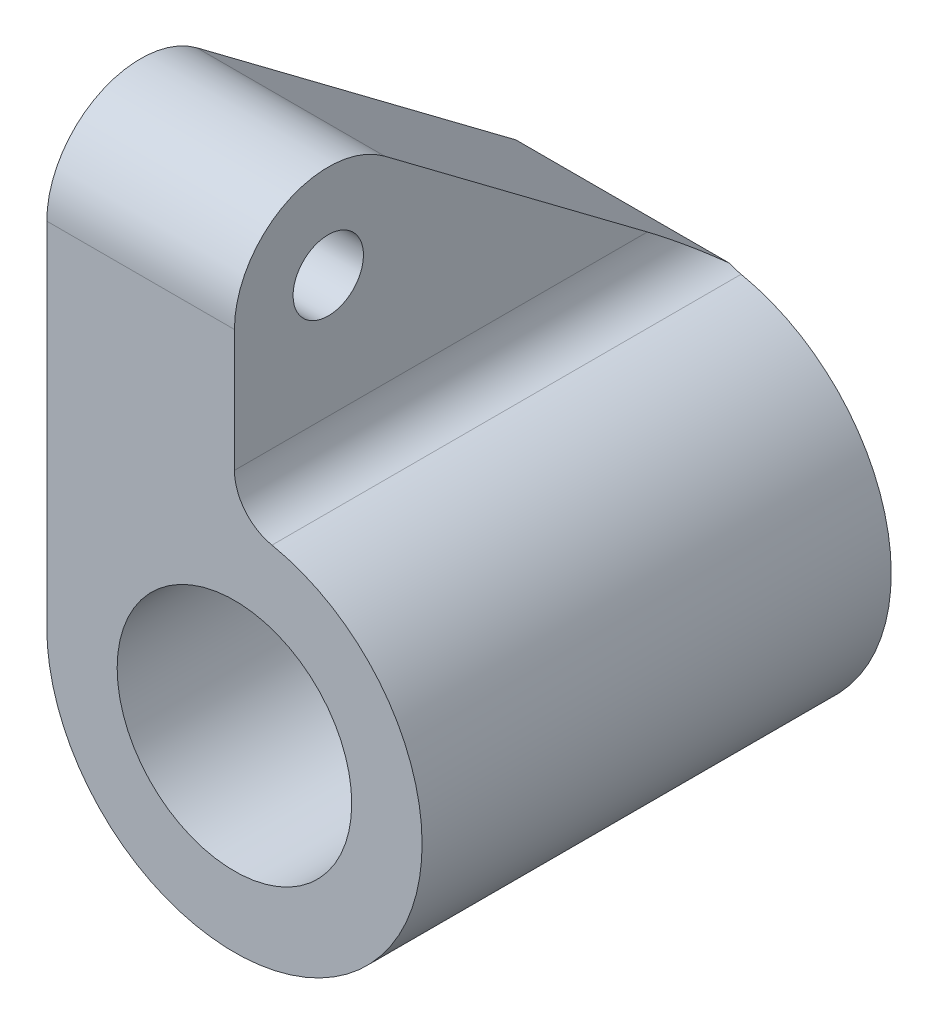
ISO-10303-21;
HEADER;
FILE_DESCRIPTION(('STEP AP214'),'2;1');
FILE_NAME('part.step','',(''),(''),'','','');
FILE_SCHEMA(('AUTOMOTIVE_DESIGN { 1 0 10303 214 1 1 1 1 }'));
ENDSEC;
DATA;
#1=APPLICATION_CONTEXT('core data for automotive mechanical design processes');
#2=APPLICATION_PROTOCOL_DEFINITION('international standard','automotive_design',2000,#1);
#3=PRODUCT_CONTEXT('',#1,'mechanical');
#4=PRODUCT('Part','Part','',(#3));
#5=PRODUCT_RELATED_PRODUCT_CATEGORY('part','',(#4));
#6=PRODUCT_DEFINITION_FORMATION('','',#4);
#7=PRODUCT_DEFINITION_CONTEXT('part definition',#1,'design');
#8=PRODUCT_DEFINITION('design','',#6,#7);
#9=PRODUCT_DEFINITION_SHAPE('','',#8);
#10=(LENGTH_UNIT() NAMED_UNIT(*) SI_UNIT(.MILLI.,.METRE.));
#11=(NAMED_UNIT(*) PLANE_ANGLE_UNIT() SI_UNIT($,.RADIAN.));
#12=(NAMED_UNIT(*) SI_UNIT($,.STERADIAN.) SOLID_ANGLE_UNIT());
#13=UNCERTAINTY_MEASURE_WITH_UNIT(LENGTH_MEASURE(1.E-05),#10,'distance_accuracy_value','');
#14=(GEOMETRIC_REPRESENTATION_CONTEXT(3) GLOBAL_UNCERTAINTY_ASSIGNED_CONTEXT((#13)) GLOBAL_UNIT_ASSIGNED_CONTEXT((#10,
#11,#12)) REPRESENTATION_CONTEXT('',''));
#15=CARTESIAN_POINT('',(0.,0.,0.));
#16=DIRECTION('',(0.,0.,1.));
#17=DIRECTION('',(1.,0.,0.));
#18=AXIS2_PLACEMENT_3D('',#15,#16,#17);
#19=CARTESIAN_POINT('',(0.,0.,20.));
#20=DIRECTION('',(0.,0.,1.));
#21=DIRECTION('',(1.,0.,0.));
#22=AXIS2_PLACEMENT_3D('',#19,#20,#21);
#23=PLANE('',#22);
#24=DIRECTION('',(-1.,0.,0.));
#25=VECTOR('',#24,1.);
#26=CARTESIAN_POINT('',(8.,15.,20.));
#27=LINE('',#26,#25);
#28=CARTESIAN_POINT('',(0.,15.,20.));
#29=VERTEX_POINT('',#28);
#30=CARTESIAN_POINT('',(-8.,15.,20.));
#31=VERTEX_POINT('',#30);
#32=EDGE_CURVE('E159',#29,#31,#27,.T.);
#33=ORIENTED_EDGE('',*,*,#32,.T.);
#34=DIRECTION('',(0.,-1.,0.));
#35=VECTOR('',#34,1.);
#36=CARTESIAN_POINT('',(-8.,0.,20.));
#37=LINE('',#36,#35);
#38=CARTESIAN_POINT('',(-8.,0.,20.));
#39=VERTEX_POINT('',#38);
#40=EDGE_CURVE('E115',#31,#39,#37,.T.);
#41=ORIENTED_EDGE('',*,*,#40,.T.);
#42=CARTESIAN_POINT('',(0.,0.,20.));
#43=DIRECTION('',(0.,0.,1.));
#44=DIRECTION('',(1.,0.,0.));
#45=AXIS2_PLACEMENT_3D('',#42,#43,#44);
#46=CIRCLE('',#45,8.);
#47=CARTESIAN_POINT('',(1.6,7.83836717690617,20.));
#48=VERTEX_POINT('',#47);
#49=EDGE_CURVE('E131',#39,#48,#46,.T.);
#50=ORIENTED_EDGE('',*,*,#49,.T.);
#51=CARTESIAN_POINT('',(2.,9.79795897113271,20.));
#52=DIRECTION('',(0.,0.,1.));
#53=DIRECTION('',(1.,0.,0.));
#54=AXIS2_PLACEMENT_3D('',#51,#52,#53);
#55=CIRCLE('',#54,2.);
#56=CARTESIAN_POINT('',(0.,9.79795897113271,20.));
#57=VERTEX_POINT('',#56);
#58=EDGE_CURVE('E146',#48,#57,#55,.F.);
#59=ORIENTED_EDGE('',*,*,#58,.T.);
#60=DIRECTION('',(0.,1.,0.));
#61=VECTOR('',#60,1.);
#62=CARTESIAN_POINT('',(0.,20.,20.));
#63=LINE('',#62,#61);
#64=EDGE_CURVE('E119',#57,#29,#63,.T.);
#65=ORIENTED_EDGE('',*,*,#64,.T.);
#66=EDGE_LOOP('',(#33,#41,#50,#59,#65));
#67=FACE_BOUND('',#66,.T.);
#68=CARTESIAN_POINT('',(0.,0.,20.));
#69=DIRECTION('',(0.,0.,1.));
#70=DIRECTION('',(1.,0.,0.));
#71=AXIS2_PLACEMENT_3D('',#68,#69,#70);
#72=CIRCLE('',#71,5.);
#73=CARTESIAN_POINT('',(5.,0.,20.));
#74=VERTEX_POINT('',#73);
#75=EDGE_CURVE('E126',#74,#74,#72,.T.);
#76=ORIENTED_EDGE('',*,*,#75,.F.);
#77=EDGE_LOOP('',(#76));
#78=FACE_BOUND('',#77,.T.);
#79=ADVANCED_FACE('F39',(#67,#78),#23,.T.);
#80=CARTESIAN_POINT('',(0.,0.,0.));
#81=DIRECTION('',(0.,0.,1.));
#82=DIRECTION('',(1.,0.,0.));
#83=AXIS2_PLACEMENT_3D('',#80,#81,#82);
#84=PLANE('',#83);
#85=DIRECTION('',(0.,-1.,0.));
#86=VECTOR('',#85,1.);
#87=CARTESIAN_POINT('',(-8.,0.,0.));
#88=LINE('',#87,#86);
#89=CARTESIAN_POINT('',(-8.,8.,0.));
#90=VERTEX_POINT('',#89);
#91=CARTESIAN_POINT('',(-8.,0.,0.));
#92=VERTEX_POINT('',#91);
#93=EDGE_CURVE('E105',#90,#92,#88,.T.);
#94=ORIENTED_EDGE('',*,*,#93,.F.);
#95=DIRECTION('',(-1.,0.,0.));
#96=VECTOR('',#95,1.);
#97=CARTESIAN_POINT('',(8.,8.,0.));
#98=LINE('',#97,#96);
#99=CARTESIAN_POINT('',(1.12401852866433,8.,0.));
#100=VERTEX_POINT('',#99);
#101=EDGE_CURVE('E53',#100,#90,#98,.T.);
#102=ORIENTED_EDGE('',*,*,#101,.F.);
#103=CARTESIAN_POINT('',(2.,9.79795897113271,0.));
#104=DIRECTION('',(0.,0.,1.));
#105=DIRECTION('',(1.,0.,0.));
#106=AXIS2_PLACEMENT_3D('',#103,#104,#105);
#107=CIRCLE('',#106,2.);
#108=CARTESIAN_POINT('',(1.6,7.83836717690617,0.));
#109=VERTEX_POINT('',#108);
#110=EDGE_CURVE('E11',#100,#109,#107,.T.);
#111=ORIENTED_EDGE('',*,*,#110,.T.);
#112=CARTESIAN_POINT('',(0.,0.,0.));
#113=DIRECTION('',(0.,0.,1.));
#114=DIRECTION('',(1.,0.,0.));
#115=AXIS2_PLACEMENT_3D('',#112,#113,#114);
#116=CIRCLE('',#115,8.);
#117=EDGE_CURVE('E113',#92,#109,#116,.T.);
#118=ORIENTED_EDGE('',*,*,#117,.F.);
#119=EDGE_LOOP('',(#94,#102,#111,#118));
#120=FACE_BOUND('',#119,.T.);
#121=CARTESIAN_POINT('',(0.,0.,0.));
#122=DIRECTION('',(0.,0.,1.));
#123=DIRECTION('',(1.,0.,0.));
#124=AXIS2_PLACEMENT_3D('',#121,#122,#123);
#125=CIRCLE('',#124,5.);
#126=CARTESIAN_POINT('',(5.,0.,0.));
#127=VERTEX_POINT('',#126);
#128=EDGE_CURVE('E117',#127,#127,#125,.T.);
#129=ORIENTED_EDGE('',*,*,#128,.T.);
#130=EDGE_LOOP('',(#129));
#131=FACE_BOUND('',#130,.T.);
#132=ADVANCED_FACE('F110',(#120,#131),#84,.F.);
#133=CARTESIAN_POINT('',(0.,0.,20.));
#134=DIRECTION('',(0.,0.,-1.));
#135=DIRECTION('',(-1.,0.,0.));
#136=AXIS2_PLACEMENT_3D('',#133,#134,#135);
#137=CYLINDRICAL_SURFACE('',#136,8.);
#138=ORIENTED_EDGE('',*,*,#117,.T.);
#139=DIRECTION('',(0.,0.,-1.));
#140=VECTOR('',#139,1.);
#141=CARTESIAN_POINT('',(1.6,7.83836717690617,20.));
#142=LINE('',#141,#140);
#143=EDGE_CURVE('E142',#109,#48,#142,.F.);
#144=ORIENTED_EDGE('',*,*,#143,.T.);
#145=ORIENTED_EDGE('',*,*,#49,.F.);
#146=DIRECTION('',(0.,0.,1.));
#147=VECTOR('',#146,1.);
#148=CARTESIAN_POINT('',(-8.,0.,0.));
#149=LINE('',#148,#147);
#150=EDGE_CURVE('E114',#92,#39,#149,.T.);
#151=ORIENTED_EDGE('',*,*,#150,.F.);
#152=EDGE_LOOP('',(#138,#144,#145,#151));
#153=FACE_BOUND('',#152,.T.);
#154=ADVANCED_FACE('F158',(#153),#137,.T.);
#155=CARTESIAN_POINT('',(0.,0.,20.));
#156=DIRECTION('',(0.,0.,-1.));
#157=DIRECTION('',(-1.,0.,0.));
#158=AXIS2_PLACEMENT_3D('',#155,#156,#157);
#159=CYLINDRICAL_SURFACE('',#158,5.);
#160=ORIENTED_EDGE('',*,*,#75,.T.);
#161=EDGE_LOOP('',(#160));
#162=FACE_BOUND('',#161,.T.);
#163=ORIENTED_EDGE('',*,*,#128,.F.);
#164=EDGE_LOOP('',(#163));
#165=FACE_BOUND('',#164,.T.);
#166=ADVANCED_FACE('F183',(#162,#165),#159,.F.);
#167=CARTESIAN_POINT('',(-8.,0.,0.));
#168=DIRECTION('',(-1.,0.,0.));
#169=DIRECTION('',(0.,0.,1.));
#170=AXIS2_PLACEMENT_3D('',#167,#168,#169);
#171=PLANE('',#170);
#172=CARTESIAN_POINT('',(-8.,15.,16.));
#173=DIRECTION('',(1.,0.,0.));
#174=DIRECTION('',(0.,0.,1.));
#175=AXIS2_PLACEMENT_3D('',#172,#173,#174);
#176=CIRCLE('',#175,4.);
#177=CARTESIAN_POINT('',(-8.,18.2,13.6));
#178=VERTEX_POINT('',#177);
#179=EDGE_CURVE('E99',#178,#31,#176,.T.);
#180=ORIENTED_EDGE('',*,*,#179,.F.);
#181=DIRECTION('',(0.,0.6,0.8));
#182=VECTOR('',#181,1.);
#183=CARTESIAN_POINT('',(-8.,18.2,13.6));
#184=LINE('',#183,#182);
#185=EDGE_CURVE('E94',#90,#178,#184,.T.);
#186=ORIENTED_EDGE('',*,*,#185,.F.);
#187=ORIENTED_EDGE('',*,*,#93,.T.);
#188=ORIENTED_EDGE('',*,*,#150,.T.);
#189=ORIENTED_EDGE('',*,*,#40,.F.);
#190=EDGE_LOOP('',(#180,#186,#187,#188,#189));
#191=FACE_BOUND('',#190,.T.);
#192=CARTESIAN_POINT('',(-8.,15.,16.));
#193=DIRECTION('',(-1.,0.,0.));
#194=DIRECTION('',(0.,0.,1.));
#195=AXIS2_PLACEMENT_3D('',#192,#193,#194);
#196=CIRCLE('',#195,1.5);
#197=CARTESIAN_POINT('',(-8.,15.,17.5));
#198=VERTEX_POINT('',#197);
#199=EDGE_CURVE('E123',#198,#198,#196,.T.);
#200=ORIENTED_EDGE('',*,*,#199,.F.);
#201=EDGE_LOOP('',(#200));
#202=FACE_BOUND('',#201,.T.);
#203=ADVANCED_FACE('F102',(#191,#202),#171,.T.);
#204=CARTESIAN_POINT('',(0.,20.,0.));
#205=DIRECTION('',(1.,0.,0.));
#206=DIRECTION('',(0.,1.,0.));
#207=AXIS2_PLACEMENT_3D('',#204,#205,#206);
#208=PLANE('',#207);
#209=ORIENTED_EDGE('',*,*,#64,.F.);
#210=DIRECTION('',(0.,0.,-1.));
#211=VECTOR('',#210,1.);
#212=CARTESIAN_POINT('',(0.,9.79795897113271,0.));
#213=LINE('',#212,#211);
#214=CARTESIAN_POINT('',(0.,9.79795897113271,2.39727862817695));
#215=VERTEX_POINT('',#214);
#216=EDGE_CURVE('E61',#57,#215,#213,.T.);
#217=ORIENTED_EDGE('',*,*,#216,.T.);
#218=DIRECTION('',(0.,-0.6,-0.8));
#219=VECTOR('',#218,1.);
#220=CARTESIAN_POINT('',(0.,12.32,5.76));
#221=LINE('',#220,#219);
#222=CARTESIAN_POINT('',(0.,18.2,13.6));
#223=VERTEX_POINT('',#222);
#224=EDGE_CURVE('E134',#223,#215,#221,.T.);
#225=ORIENTED_EDGE('',*,*,#224,.F.);
#226=CARTESIAN_POINT('',(0.,15.,16.));
#227=DIRECTION('',(1.,0.,0.));
#228=DIRECTION('',(0.,1.,0.));
#229=AXIS2_PLACEMENT_3D('',#226,#227,#228);
#230=CIRCLE('',#229,4.);
#231=EDGE_CURVE('E139',#29,#223,#230,.F.);
#232=ORIENTED_EDGE('',*,*,#231,.F.);
#233=EDGE_LOOP('',(#209,#217,#225,#232));
#234=FACE_BOUND('',#233,.T.);
#235=CARTESIAN_POINT('',(0.,15.,16.));
#236=DIRECTION('',(1.,0.,0.));
#237=DIRECTION('',(0.,1.,0.));
#238=AXIS2_PLACEMENT_3D('',#235,#236,#237);
#239=CIRCLE('',#238,1.5);
#240=CARTESIAN_POINT('',(0.,16.5,16.));
#241=VERTEX_POINT('',#240);
#242=EDGE_CURVE('E124',#241,#241,#239,.T.);
#243=ORIENTED_EDGE('',*,*,#242,.F.);
#244=EDGE_LOOP('',(#243));
#245=FACE_BOUND('',#244,.T.);
#246=ADVANCED_FACE('F155',(#234,#245),#208,.T.);
#247=CARTESIAN_POINT('',(8.,15.,16.));
#248=DIRECTION('',(-1.,0.,0.));
#249=DIRECTION('',(0.,0.,1.));
#250=AXIS2_PLACEMENT_3D('',#247,#248,#249);
#251=CYLINDRICAL_SURFACE('',#250,1.5);
#252=ORIENTED_EDGE('',*,*,#242,.T.);
#253=EDGE_LOOP('',(#252));
#254=FACE_BOUND('',#253,.T.);
#255=ORIENTED_EDGE('',*,*,#199,.T.);
#256=EDGE_LOOP('',(#255));
#257=FACE_BOUND('',#256,.T.);
#258=ADVANCED_FACE('F167',(#254,#257),#251,.F.);
#259=CARTESIAN_POINT('',(8.,15.,16.));
#260=DIRECTION('',(-1.,0.,0.));
#261=DIRECTION('',(0.,0.,1.));
#262=AXIS2_PLACEMENT_3D('',#259,#260,#261);
#263=CYLINDRICAL_SURFACE('',#262,4.);
#264=ORIENTED_EDGE('',*,*,#231,.T.);
#265=DIRECTION('',(-1.,0.,0.));
#266=VECTOR('',#265,1.);
#267=CARTESIAN_POINT('',(8.,18.2,13.6));
#268=LINE('',#267,#266);
#269=EDGE_CURVE('E98',#223,#178,#268,.T.);
#270=ORIENTED_EDGE('',*,*,#269,.T.);
#271=ORIENTED_EDGE('',*,*,#179,.T.);
#272=ORIENTED_EDGE('',*,*,#32,.F.);
#273=EDGE_LOOP('',(#264,#270,#271,#272));
#274=FACE_BOUND('',#273,.T.);
#275=ADVANCED_FACE('F165',(#274),#263,.T.);
#276=CARTESIAN_POINT('',(8.,18.2,13.6));
#277=DIRECTION('',(0.,-0.8,0.6));
#278=DIRECTION('',(0.,-0.6,-0.8));
#279=AXIS2_PLACEMENT_3D('',#276,#277,#278);
#280=PLANE('',#279);
#281=ORIENTED_EDGE('',*,*,#224,.T.);
#282=CARTESIAN_POINT('',(2.,9.79795897113271,2.39727862817695));
#283=DIRECTION('',(0.,-0.8,0.6));
#284=DIRECTION('',(0.,-0.6,-0.8));
#285=AXIS2_PLACEMENT_3D('',#282,#283,#284);
#286=ELLIPSE('',#285,3.33333333333333,2.);
#287=EDGE_CURVE('E47',#215,#100,#286,.T.);
#288=ORIENTED_EDGE('',*,*,#287,.T.);
#289=ORIENTED_EDGE('',*,*,#101,.T.);
#290=ORIENTED_EDGE('',*,*,#185,.T.);
#291=ORIENTED_EDGE('',*,*,#269,.F.);
#292=EDGE_LOOP('',(#281,#288,#289,#290,#291));
#293=FACE_BOUND('',#292,.T.);
#294=ADVANCED_FACE('F93',(#293),#280,.F.);
#295=CARTESIAN_POINT('',(2.,9.79795897113271,20.));
#296=DIRECTION('',(0.,0.,-1.));
#297=DIRECTION('',(-1.,0.,0.));
#298=AXIS2_PLACEMENT_3D('',#295,#296,#297);
#299=CYLINDRICAL_SURFACE('',#298,2.);
#300=ORIENTED_EDGE('',*,*,#287,.F.);
#301=ORIENTED_EDGE('',*,*,#216,.F.);
#302=ORIENTED_EDGE('',*,*,#58,.F.);
#303=ORIENTED_EDGE('',*,*,#143,.F.);
#304=ORIENTED_EDGE('',*,*,#110,.F.);
#305=EDGE_LOOP('',(#300,#301,#302,#303,#304));
#306=FACE_BOUND('',#305,.T.);
#307=ADVANCED_FACE('F41',(#306),#299,.F.);
#308=CLOSED_SHELL('',(#79,#132,#154,#166,#203,#246,#258,#275,#294,#307));
#309=MANIFOLD_SOLID_BREP('B2',#308);
#310=ADVANCED_BREP_SHAPE_REPRESENTATION('',(#18,#309),#14);
#311=SHAPE_DEFINITION_REPRESENTATION(#9,#310);
ENDSEC;
END-ISO-10303-21;
